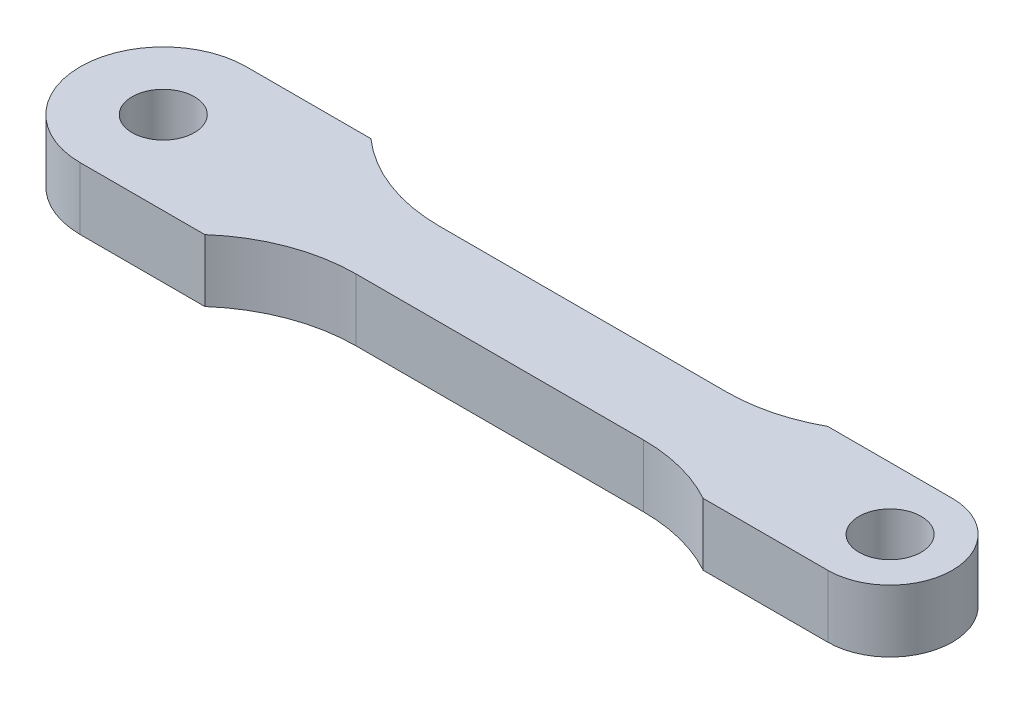
ISO-10303-21;
HEADER;
FILE_DESCRIPTION(('STEP AP214'),'2;1');
FILE_NAME('part.step','',(''),(''),'','','');
FILE_SCHEMA(('AUTOMOTIVE_DESIGN { 1 0 10303 214 1 1 1 1 }'));
ENDSEC;
DATA;
#1=APPLICATION_CONTEXT('core data for automotive mechanical design processes');
#2=APPLICATION_PROTOCOL_DEFINITION('international standard','automotive_design',2000,#1);
#3=PRODUCT_CONTEXT('',#1,'mechanical');
#4=PRODUCT('Part','Part','',(#3));
#5=PRODUCT_RELATED_PRODUCT_CATEGORY('part','',(#4));
#6=PRODUCT_DEFINITION_FORMATION('','',#4);
#7=PRODUCT_DEFINITION_CONTEXT('part definition',#1,'design');
#8=PRODUCT_DEFINITION('design','',#6,#7);
#9=PRODUCT_DEFINITION_SHAPE('','',#8);
#10=(LENGTH_UNIT() NAMED_UNIT(*) SI_UNIT(.MILLI.,.METRE.));
#11=(NAMED_UNIT(*) PLANE_ANGLE_UNIT() SI_UNIT($,.RADIAN.));
#12=(NAMED_UNIT(*) SI_UNIT($,.STERADIAN.) SOLID_ANGLE_UNIT());
#13=UNCERTAINTY_MEASURE_WITH_UNIT(LENGTH_MEASURE(1.E-05),#10,'distance_accuracy_value','');
#14=(GEOMETRIC_REPRESENTATION_CONTEXT(3) GLOBAL_UNCERTAINTY_ASSIGNED_CONTEXT((#13)) GLOBAL_UNIT_ASSIGNED_CONTEXT((#10,
#11,#12)) REPRESENTATION_CONTEXT('',''));
#15=CARTESIAN_POINT('',(0.,0.,0.));
#16=DIRECTION('',(0.,0.,1.));
#17=DIRECTION('',(1.,0.,0.));
#18=AXIS2_PLACEMENT_3D('',#15,#16,#17);
#19=CARTESIAN_POINT('',(0.,1.5,2.99999999999999));
#20=DIRECTION('',(0.,0.,1.));
#21=DIRECTION('',(1.,0.,0.));
#22=AXIS2_PLACEMENT_3D('',#19,#20,#21);
#23=PLANE('',#22);
#24=DIRECTION('',(-1.,0.,0.));
#25=VECTOR('',#24,1.);
#26=CARTESIAN_POINT('',(0.,-1.5,2.99999999999999));
#27=LINE('',#26,#25);
#28=CARTESIAN_POINT('',(17.5,-1.5,3.));
#29=VERTEX_POINT('',#28);
#30=CARTESIAN_POINT('',(11.5,-1.5,3.));
#31=VERTEX_POINT('',#30);
#32=EDGE_CURVE('E161',#29,#31,#27,.T.);
#33=ORIENTED_EDGE('',*,*,#32,.F.);
#34=DIRECTION('',(0.,-1.,0.));
#35=VECTOR('',#34,1.);
#36=CARTESIAN_POINT('',(17.5,1.5,3.));
#37=LINE('',#36,#35);
#38=CARTESIAN_POINT('',(17.5,1.5,3.));
#39=VERTEX_POINT('',#38);
#40=EDGE_CURVE('E11',#39,#29,#37,.T.);
#41=ORIENTED_EDGE('',*,*,#40,.F.);
#42=DIRECTION('',(-1.,0.,0.));
#43=VECTOR('',#42,1.);
#44=CARTESIAN_POINT('',(0.,1.5,2.99999999999999));
#45=LINE('',#44,#43);
#46=CARTESIAN_POINT('',(11.5,1.5,3.));
#47=VERTEX_POINT('',#46);
#48=EDGE_CURVE('E196',#39,#47,#45,.T.);
#49=ORIENTED_EDGE('',*,*,#48,.T.);
#50=DIRECTION('',(0.,-1.,0.));
#51=VECTOR('',#50,1.);
#52=CARTESIAN_POINT('',(11.5,1.5,3.));
#53=LINE('',#52,#51);
#54=EDGE_CURVE('E99',#47,#31,#53,.T.);
#55=ORIENTED_EDGE('',*,*,#54,.T.);
#56=EDGE_LOOP('',(#33,#41,#49,#55));
#57=FACE_BOUND('',#56,.T.);
#58=ADVANCED_FACE('F37',(#57),#23,.T.);
#59=CARTESIAN_POINT('',(17.5,1.5,0.));
#60=DIRECTION('',(0.,-1.,0.));
#61=DIRECTION('',(0.,0.,-1.));
#62=AXIS2_PLACEMENT_3D('',#59,#60,#61);
#63=CYLINDRICAL_SURFACE('',#62,3.);
#64=CARTESIAN_POINT('',(17.5,-1.5,0.));
#65=DIRECTION('',(0.,1.,0.));
#66=DIRECTION('',(0.,0.,1.));
#67=AXIS2_PLACEMENT_3D('',#64,#65,#66);
#68=CIRCLE('',#67,3.);
#69=CARTESIAN_POINT('',(17.5,-1.5,-3.));
#70=VERTEX_POINT('',#69);
#71=EDGE_CURVE('E164',#29,#70,#68,.T.);
#72=ORIENTED_EDGE('',*,*,#71,.T.);
#73=DIRECTION('',(0.,-1.,0.));
#74=VECTOR('',#73,1.);
#75=CARTESIAN_POINT('',(17.5,1.5,-3.));
#76=LINE('',#75,#74);
#77=CARTESIAN_POINT('',(17.5,1.5,-3.));
#78=VERTEX_POINT('',#77);
#79=EDGE_CURVE('E45',#78,#70,#76,.T.);
#80=ORIENTED_EDGE('',*,*,#79,.F.);
#81=CARTESIAN_POINT('',(17.5,1.5,0.));
#82=DIRECTION('',(0.,1.,0.));
#83=DIRECTION('',(0.,0.,1.));
#84=AXIS2_PLACEMENT_3D('',#81,#82,#83);
#85=CIRCLE('',#84,3.);
#86=EDGE_CURVE('E239',#39,#78,#85,.T.);
#87=ORIENTED_EDGE('',*,*,#86,.F.);
#88=ORIENTED_EDGE('',*,*,#40,.T.);
#89=EDGE_LOOP('',(#72,#80,#87,#88));
#90=FACE_BOUND('',#89,.T.);
#91=ADVANCED_FACE('F259',(#90),#63,.T.);
#92=CARTESIAN_POINT('',(0.,1.5,-2.99999999999999));
#93=DIRECTION('',(0.,0.,1.));
#94=DIRECTION('',(1.,0.,0.));
#95=AXIS2_PLACEMENT_3D('',#92,#93,#94);
#96=PLANE('',#95);
#97=DIRECTION('',(-1.,0.,0.));
#98=VECTOR('',#97,1.);
#99=CARTESIAN_POINT('',(0.,-1.5,-2.99999999999999));
#100=LINE('',#99,#98);
#101=CARTESIAN_POINT('',(11.5,-1.5,-3.));
#102=VERTEX_POINT('',#101);
#103=EDGE_CURVE('E166',#70,#102,#100,.T.);
#104=ORIENTED_EDGE('',*,*,#103,.T.);
#105=DIRECTION('',(0.,-1.,0.));
#106=VECTOR('',#105,1.);
#107=CARTESIAN_POINT('',(11.5,1.5,-3.));
#108=LINE('',#107,#106);
#109=CARTESIAN_POINT('',(11.5,1.5,-3.));
#110=VERTEX_POINT('',#109);
#111=EDGE_CURVE('E212',#110,#102,#108,.T.);
#112=ORIENTED_EDGE('',*,*,#111,.F.);
#113=DIRECTION('',(-1.,0.,0.));
#114=VECTOR('',#113,1.);
#115=CARTESIAN_POINT('',(0.,1.5,-2.99999999999999));
#116=LINE('',#115,#114);
#117=EDGE_CURVE('E220',#78,#110,#116,.T.);
#118=ORIENTED_EDGE('',*,*,#117,.F.);
#119=ORIENTED_EDGE('',*,*,#79,.T.);
#120=EDGE_LOOP('',(#104,#112,#118,#119));
#121=FACE_BOUND('',#120,.T.);
#122=ADVANCED_FACE('F218',(#121),#96,.F.);
#123=CARTESIAN_POINT('',(7.62701665379259,1.5,-10.));
#124=DIRECTION('',(0.,-1.,0.));
#125=DIRECTION('',(0.,0.,-1.));
#126=AXIS2_PLACEMENT_3D('',#123,#124,#125);
#127=CYLINDRICAL_SURFACE('',#126,8.);
#128=CARTESIAN_POINT('',(7.62701665379259,-1.5,-10.));
#129=DIRECTION('',(0.,1.,0.));
#130=DIRECTION('',(0.,0.,1.));
#131=AXIS2_PLACEMENT_3D('',#128,#129,#130);
#132=CIRCLE('',#131,8.);
#133=CARTESIAN_POINT('',(7.62701665379259,-1.5,-2.));
#134=VERTEX_POINT('',#133);
#135=EDGE_CURVE('E169',#134,#102,#132,.T.);
#136=ORIENTED_EDGE('',*,*,#135,.F.);
#137=DIRECTION('',(0.,-1.,0.));
#138=VECTOR('',#137,1.);
#139=CARTESIAN_POINT('',(7.62701665379259,1.5,-2.));
#140=LINE('',#139,#138);
#141=CARTESIAN_POINT('',(7.62701665379259,1.5,-2.));
#142=VERTEX_POINT('',#141);
#143=EDGE_CURVE('E210',#142,#134,#140,.T.);
#144=ORIENTED_EDGE('',*,*,#143,.F.);
#145=CARTESIAN_POINT('',(7.62701665379259,1.5,-10.));
#146=DIRECTION('',(0.,1.,0.));
#147=DIRECTION('',(0.,0.,1.));
#148=AXIS2_PLACEMENT_3D('',#145,#146,#147);
#149=CIRCLE('',#148,8.);
#150=EDGE_CURVE('E234',#142,#110,#149,.T.);
#151=ORIENTED_EDGE('',*,*,#150,.T.);
#152=ORIENTED_EDGE('',*,*,#111,.T.);
#153=EDGE_LOOP('',(#136,#144,#151,#152));
#154=FACE_BOUND('',#153,.T.);
#155=ADVANCED_FACE('F230',(#154),#127,.F.);
#156=CARTESIAN_POINT('',(0.,1.5,-2.));
#157=DIRECTION('',(0.,0.,1.));
#158=DIRECTION('',(1.,0.,0.));
#159=AXIS2_PLACEMENT_3D('',#156,#157,#158);
#160=PLANE('',#159);
#161=DIRECTION('',(-1.,0.,0.));
#162=VECTOR('',#161,1.);
#163=CARTESIAN_POINT('',(0.,-1.5,-2.));
#164=LINE('',#163,#162);
#165=CARTESIAN_POINT('',(-6.20849737787082,-1.5,-2.));
#166=VERTEX_POINT('',#165);
#167=EDGE_CURVE('E172',#134,#166,#164,.T.);
#168=ORIENTED_EDGE('',*,*,#167,.T.);
#169=DIRECTION('',(0.,-1.,0.));
#170=VECTOR('',#169,1.);
#171=CARTESIAN_POINT('',(-6.20849737787082,1.5,-2.));
#172=LINE('',#171,#170);
#173=CARTESIAN_POINT('',(-6.20849737787082,1.5,-2.));
#174=VERTEX_POINT('',#173);
#175=EDGE_CURVE('E207',#174,#166,#172,.T.);
#176=ORIENTED_EDGE('',*,*,#175,.F.);
#177=DIRECTION('',(-1.,0.,0.));
#178=VECTOR('',#177,1.);
#179=CARTESIAN_POINT('',(0.,1.5,-2.));
#180=LINE('',#179,#178);
#181=EDGE_CURVE('E235',#142,#174,#180,.T.);
#182=ORIENTED_EDGE('',*,*,#181,.F.);
#183=ORIENTED_EDGE('',*,*,#143,.T.);
#184=EDGE_LOOP('',(#168,#176,#182,#183));
#185=FACE_BOUND('',#184,.T.);
#186=ADVANCED_FACE('F269',(#185),#160,.F.);
#187=CARTESIAN_POINT('',(-6.20849737787082,1.5,-10.));
#188=DIRECTION('',(0.,-1.,0.));
#189=DIRECTION('',(0.,0.,-1.));
#190=AXIS2_PLACEMENT_3D('',#187,#188,#189);
#191=CYLINDRICAL_SURFACE('',#190,8.);
#192=CARTESIAN_POINT('',(-6.20849737787082,-1.5,-10.));
#193=DIRECTION('',(0.,1.,0.));
#194=DIRECTION('',(0.,0.,1.));
#195=AXIS2_PLACEMENT_3D('',#192,#193,#194);
#196=CIRCLE('',#195,8.);
#197=CARTESIAN_POINT('',(-11.5,-1.5,-4.));
#198=VERTEX_POINT('',#197);
#199=EDGE_CURVE('E174',#166,#198,#196,.F.);
#200=ORIENTED_EDGE('',*,*,#199,.T.);
#201=DIRECTION('',(0.,-1.,0.));
#202=VECTOR('',#201,1.);
#203=CARTESIAN_POINT('',(-11.5,1.5,-4.));
#204=LINE('',#203,#202);
#205=CARTESIAN_POINT('',(-11.5,1.5,-4.));
#206=VERTEX_POINT('',#205);
#207=EDGE_CURVE('E205',#206,#198,#204,.T.);
#208=ORIENTED_EDGE('',*,*,#207,.F.);
#209=CARTESIAN_POINT('',(-6.20849737787082,1.5,-10.));
#210=DIRECTION('',(0.,1.,0.));
#211=DIRECTION('',(0.,0.,1.));
#212=AXIS2_PLACEMENT_3D('',#209,#210,#211);
#213=CIRCLE('',#212,8.);
#214=EDGE_CURVE('E237',#174,#206,#213,.F.);
#215=ORIENTED_EDGE('',*,*,#214,.F.);
#216=ORIENTED_EDGE('',*,*,#175,.T.);
#217=EDGE_LOOP('',(#200,#208,#215,#216));
#218=FACE_BOUND('',#217,.T.);
#219=ADVANCED_FACE('F272',(#218),#191,.F.);
#220=CARTESIAN_POINT('',(0.,1.5,-3.99999999999999));
#221=DIRECTION('',(0.,0.,-1.));
#222=DIRECTION('',(-1.,0.,0.));
#223=AXIS2_PLACEMENT_3D('',#220,#221,#222);
#224=PLANE('',#223);
#225=DIRECTION('',(1.,0.,0.));
#226=VECTOR('',#225,1.);
#227=CARTESIAN_POINT('',(0.,-1.5,-3.99999999999999));
#228=LINE('',#227,#226);
#229=CARTESIAN_POINT('',(-17.5,-1.5,-4.00000000000001));
#230=VERTEX_POINT('',#229);
#231=EDGE_CURVE('E177',#230,#198,#228,.T.);
#232=ORIENTED_EDGE('',*,*,#231,.F.);
#233=DIRECTION('',(0.,-1.,0.));
#234=VECTOR('',#233,1.);
#235=CARTESIAN_POINT('',(-17.5,1.5,-4.00000000000001));
#236=LINE('',#235,#234);
#237=CARTESIAN_POINT('',(-17.5,1.5,-4.00000000000001));
#238=VERTEX_POINT('',#237);
#239=EDGE_CURVE('E203',#238,#230,#236,.T.);
#240=ORIENTED_EDGE('',*,*,#239,.F.);
#241=DIRECTION('',(1.,0.,0.));
#242=VECTOR('',#241,1.);
#243=CARTESIAN_POINT('',(0.,1.5,-3.99999999999999));
#244=LINE('',#243,#242);
#245=EDGE_CURVE('E244',#238,#206,#244,.T.);
#246=ORIENTED_EDGE('',*,*,#245,.T.);
#247=ORIENTED_EDGE('',*,*,#207,.T.);
#248=EDGE_LOOP('',(#232,#240,#246,#247));
#249=FACE_BOUND('',#248,.T.);
#250=ADVANCED_FACE('F276',(#249),#224,.T.);
#251=CARTESIAN_POINT('',(-17.5,1.5,0.));
#252=DIRECTION('',(0.,-1.,0.));
#253=DIRECTION('',(0.,0.,-1.));
#254=AXIS2_PLACEMENT_3D('',#251,#252,#253);
#255=CYLINDRICAL_SURFACE('',#254,4.00000000000001);
#256=CARTESIAN_POINT('',(-17.5,-1.5,0.));
#257=DIRECTION('',(0.,1.,0.));
#258=DIRECTION('',(0.,0.,1.));
#259=AXIS2_PLACEMENT_3D('',#256,#257,#258);
#260=CIRCLE('',#259,4.00000000000001);
#261=CARTESIAN_POINT('',(-17.5,-1.5,4.00000000000001));
#262=VERTEX_POINT('',#261);
#263=EDGE_CURVE('E180',#230,#262,#260,.T.);
#264=ORIENTED_EDGE('',*,*,#263,.T.);
#265=DIRECTION('',(0.,-1.,0.));
#266=VECTOR('',#265,1.);
#267=CARTESIAN_POINT('',(-17.5,1.5,4.00000000000001));
#268=LINE('',#267,#266);
#269=CARTESIAN_POINT('',(-17.5,1.5,4.00000000000001));
#270=VERTEX_POINT('',#269);
#271=EDGE_CURVE('E200',#270,#262,#268,.T.);
#272=ORIENTED_EDGE('',*,*,#271,.F.);
#273=CARTESIAN_POINT('',(-17.5,1.5,0.));
#274=DIRECTION('',(0.,1.,0.));
#275=DIRECTION('',(0.,0.,1.));
#276=AXIS2_PLACEMENT_3D('',#273,#274,#275);
#277=CIRCLE('',#276,4.00000000000001);
#278=EDGE_CURVE('E247',#238,#270,#277,.T.);
#279=ORIENTED_EDGE('',*,*,#278,.F.);
#280=ORIENTED_EDGE('',*,*,#239,.T.);
#281=EDGE_LOOP('',(#264,#272,#279,#280));
#282=FACE_BOUND('',#281,.T.);
#283=ADVANCED_FACE('F252',(#282),#255,.T.);
#284=CARTESIAN_POINT('',(0.,1.5,3.99999999999999));
#285=DIRECTION('',(0.,0.,-1.));
#286=DIRECTION('',(-1.,0.,0.));
#287=AXIS2_PLACEMENT_3D('',#284,#285,#286);
#288=PLANE('',#287);
#289=DIRECTION('',(1.,0.,0.));
#290=VECTOR('',#289,1.);
#291=CARTESIAN_POINT('',(0.,-1.5,3.99999999999999));
#292=LINE('',#291,#290);
#293=CARTESIAN_POINT('',(-11.5,-1.5,4.));
#294=VERTEX_POINT('',#293);
#295=EDGE_CURVE('E182',#262,#294,#292,.T.);
#296=ORIENTED_EDGE('',*,*,#295,.T.);
#297=DIRECTION('',(0.,-1.,0.));
#298=VECTOR('',#297,1.);
#299=CARTESIAN_POINT('',(-11.5,1.5,4.));
#300=LINE('',#299,#298);
#301=CARTESIAN_POINT('',(-11.5,1.5,4.));
#302=VERTEX_POINT('',#301);
#303=EDGE_CURVE('E141',#302,#294,#300,.T.);
#304=ORIENTED_EDGE('',*,*,#303,.F.);
#305=DIRECTION('',(1.,0.,0.));
#306=VECTOR('',#305,1.);
#307=CARTESIAN_POINT('',(0.,1.5,3.99999999999999));
#308=LINE('',#307,#306);
#309=EDGE_CURVE('E147',#270,#302,#308,.T.);
#310=ORIENTED_EDGE('',*,*,#309,.F.);
#311=ORIENTED_EDGE('',*,*,#271,.T.);
#312=EDGE_LOOP('',(#296,#304,#310,#311));
#313=FACE_BOUND('',#312,.T.);
#314=ADVANCED_FACE('F256',(#313),#288,.F.);
#315=CARTESIAN_POINT('',(-6.20849737787082,1.5,10.));
#316=DIRECTION('',(0.,-1.,0.));
#317=DIRECTION('',(0.,0.,-1.));
#318=AXIS2_PLACEMENT_3D('',#315,#316,#317);
#319=CYLINDRICAL_SURFACE('',#318,8.);
#320=CARTESIAN_POINT('',(-6.20849737787082,-1.5,10.));
#321=DIRECTION('',(0.,1.,0.));
#322=DIRECTION('',(0.,0.,1.));
#323=AXIS2_PLACEMENT_3D('',#320,#321,#322);
#324=CIRCLE('',#323,8.);
#325=CARTESIAN_POINT('',(-6.20849737787082,-1.5,2.));
#326=VERTEX_POINT('',#325);
#327=EDGE_CURVE('E136',#326,#294,#324,.T.);
#328=ORIENTED_EDGE('',*,*,#327,.F.);
#329=DIRECTION('',(0.,-1.,0.));
#330=VECTOR('',#329,1.);
#331=CARTESIAN_POINT('',(-6.20849737787082,1.5,2.));
#332=LINE('',#331,#330);
#333=CARTESIAN_POINT('',(-6.20849737787082,1.5,2.));
#334=VERTEX_POINT('',#333);
#335=EDGE_CURVE('E131',#334,#326,#332,.T.);
#336=ORIENTED_EDGE('',*,*,#335,.F.);
#337=CARTESIAN_POINT('',(-6.20849737787082,1.5,10.));
#338=DIRECTION('',(0.,1.,0.));
#339=DIRECTION('',(0.,0.,1.));
#340=AXIS2_PLACEMENT_3D('',#337,#338,#339);
#341=CIRCLE('',#340,8.);
#342=EDGE_CURVE('E134',#334,#302,#341,.T.);
#343=ORIENTED_EDGE('',*,*,#342,.T.);
#344=ORIENTED_EDGE('',*,*,#303,.T.);
#345=EDGE_LOOP('',(#328,#336,#343,#344));
#346=FACE_BOUND('',#345,.T.);
#347=ADVANCED_FACE('F133',(#346),#319,.F.);
#348=CARTESIAN_POINT('',(0.,1.5,2.));
#349=DIRECTION('',(0.,0.,1.));
#350=DIRECTION('',(1.,0.,0.));
#351=AXIS2_PLACEMENT_3D('',#348,#349,#350);
#352=PLANE('',#351);
#353=DIRECTION('',(-1.,0.,0.));
#354=VECTOR('',#353,1.);
#355=CARTESIAN_POINT('',(0.,-1.5,2.));
#356=LINE('',#355,#354);
#357=CARTESIAN_POINT('',(7.62701665379259,-1.5,2.));
#358=VERTEX_POINT('',#357);
#359=EDGE_CURVE('E186',#358,#326,#356,.T.);
#360=ORIENTED_EDGE('',*,*,#359,.F.);
#361=DIRECTION('',(0.,-1.,0.));
#362=VECTOR('',#361,1.);
#363=CARTESIAN_POINT('',(7.62701665379259,1.5,2.));
#364=LINE('',#363,#362);
#365=CARTESIAN_POINT('',(7.62701665379259,1.5,2.));
#366=VERTEX_POINT('',#365);
#367=EDGE_CURVE('E92',#366,#358,#364,.T.);
#368=ORIENTED_EDGE('',*,*,#367,.F.);
#369=DIRECTION('',(-1.,0.,0.));
#370=VECTOR('',#369,1.);
#371=CARTESIAN_POINT('',(0.,1.5,2.));
#372=LINE('',#371,#370);
#373=EDGE_CURVE('E145',#366,#334,#372,.T.);
#374=ORIENTED_EDGE('',*,*,#373,.T.);
#375=ORIENTED_EDGE('',*,*,#335,.T.);
#376=EDGE_LOOP('',(#360,#368,#374,#375));
#377=FACE_BOUND('',#376,.T.);
#378=ADVANCED_FACE('F150',(#377),#352,.T.);
#379=CARTESIAN_POINT('',(17.5,1.5,0.));
#380=DIRECTION('',(0.,-1.,0.));
#381=DIRECTION('',(0.,0.,-1.));
#382=AXIS2_PLACEMENT_3D('',#379,#380,#381);
#383=CYLINDRICAL_SURFACE('',#382,1.5);
#384=CARTESIAN_POINT('',(17.5,1.5,0.));
#385=DIRECTION('',(0.,1.,0.));
#386=DIRECTION('',(0.,0.,1.));
#387=AXIS2_PLACEMENT_3D('',#384,#385,#386);
#388=CIRCLE('',#387,1.5);
#389=CARTESIAN_POINT('',(17.5,1.5,1.5));
#390=VERTEX_POINT('',#389);
#391=EDGE_CURVE('E152',#390,#390,#388,.T.);
#392=ORIENTED_EDGE('',*,*,#391,.T.);
#393=EDGE_LOOP('',(#392));
#394=FACE_BOUND('',#393,.T.);
#395=CARTESIAN_POINT('',(17.5,-1.5,0.));
#396=DIRECTION('',(0.,1.,0.));
#397=DIRECTION('',(0.,0.,1.));
#398=AXIS2_PLACEMENT_3D('',#395,#396,#397);
#399=CIRCLE('',#398,1.5);
#400=CARTESIAN_POINT('',(17.5,-1.5,1.5));
#401=VERTEX_POINT('',#400);
#402=EDGE_CURVE('E190',#401,#401,#399,.T.);
#403=ORIENTED_EDGE('',*,*,#402,.F.);
#404=EDGE_LOOP('',(#403));
#405=FACE_BOUND('',#404,.T.);
#406=ADVANCED_FACE('F289',(#394,#405),#383,.F.);
#407=CARTESIAN_POINT('',(7.62701665379259,1.5,10.));
#408=DIRECTION('',(0.,-1.,0.));
#409=DIRECTION('',(0.,0.,-1.));
#410=AXIS2_PLACEMENT_3D('',#407,#408,#409);
#411=CYLINDRICAL_SURFACE('',#410,8.);
#412=CARTESIAN_POINT('',(7.62701665379259,-1.5,10.));
#413=DIRECTION('',(0.,1.,0.));
#414=DIRECTION('',(0.,0.,1.));
#415=AXIS2_PLACEMENT_3D('',#412,#413,#414);
#416=CIRCLE('',#415,8.);
#417=EDGE_CURVE('E188',#358,#31,#416,.F.);
#418=ORIENTED_EDGE('',*,*,#417,.T.);
#419=ORIENTED_EDGE('',*,*,#54,.F.);
#420=CARTESIAN_POINT('',(7.62701665379259,1.5,10.));
#421=DIRECTION('',(0.,1.,0.));
#422=DIRECTION('',(0.,0.,1.));
#423=AXIS2_PLACEMENT_3D('',#420,#421,#422);
#424=CIRCLE('',#423,8.);
#425=EDGE_CURVE('E53',#366,#47,#424,.F.);
#426=ORIENTED_EDGE('',*,*,#425,.F.);
#427=ORIENTED_EDGE('',*,*,#367,.T.);
#428=EDGE_LOOP('',(#418,#419,#426,#427));
#429=FACE_BOUND('',#428,.T.);
#430=ADVANCED_FACE('F257',(#429),#411,.F.);
#431=CARTESIAN_POINT('',(-17.5,1.5,0.));
#432=DIRECTION('',(0.,-1.,0.));
#433=DIRECTION('',(0.,0.,-1.));
#434=AXIS2_PLACEMENT_3D('',#431,#432,#433);
#435=CYLINDRICAL_SURFACE('',#434,1.5);
#436=CARTESIAN_POINT('',(-17.5,1.5,0.));
#437=DIRECTION('',(0.,1.,0.));
#438=DIRECTION('',(0.,0.,1.));
#439=AXIS2_PLACEMENT_3D('',#436,#437,#438);
#440=CIRCLE('',#439,1.5);
#441=CARTESIAN_POINT('',(-17.5,1.5,1.5));
#442=VERTEX_POINT('',#441);
#443=EDGE_CURVE('E158',#442,#442,#440,.T.);
#444=ORIENTED_EDGE('',*,*,#443,.T.);
#445=EDGE_LOOP('',(#444));
#446=FACE_BOUND('',#445,.T.);
#447=CARTESIAN_POINT('',(-17.5,-1.5,0.));
#448=DIRECTION('',(0.,1.,0.));
#449=DIRECTION('',(0.,0.,1.));
#450=AXIS2_PLACEMENT_3D('',#447,#448,#449);
#451=CIRCLE('',#450,1.5);
#452=CARTESIAN_POINT('',(-17.5,-1.5,1.5));
#453=VERTEX_POINT('',#452);
#454=EDGE_CURVE('E193',#453,#453,#451,.T.);
#455=ORIENTED_EDGE('',*,*,#454,.F.);
#456=EDGE_LOOP('',(#455));
#457=FACE_BOUND('',#456,.T.);
#458=ADVANCED_FACE('F292',(#446,#457),#435,.F.);
#459=CARTESIAN_POINT('',(0.,1.5,0.));
#460=DIRECTION('',(0.,1.,0.));
#461=DIRECTION('',(0.,0.,1.));
#462=AXIS2_PLACEMENT_3D('',#459,#460,#461);
#463=PLANE('',#462);
#464=ORIENTED_EDGE('',*,*,#48,.F.);
#465=ORIENTED_EDGE('',*,*,#86,.T.);
#466=ORIENTED_EDGE('',*,*,#117,.T.);
#467=ORIENTED_EDGE('',*,*,#150,.F.);
#468=ORIENTED_EDGE('',*,*,#181,.T.);
#469=ORIENTED_EDGE('',*,*,#214,.T.);
#470=ORIENTED_EDGE('',*,*,#245,.F.);
#471=ORIENTED_EDGE('',*,*,#278,.T.);
#472=ORIENTED_EDGE('',*,*,#309,.T.);
#473=ORIENTED_EDGE('',*,*,#342,.F.);
#474=ORIENTED_EDGE('',*,*,#373,.F.);
#475=ORIENTED_EDGE('',*,*,#425,.T.);
#476=EDGE_LOOP('',(#464,#465,#466,#467,#468,#469,#470,#471,#472,#473,#474,#475));
#477=FACE_BOUND('',#476,.T.);
#478=ORIENTED_EDGE('',*,*,#391,.F.);
#479=EDGE_LOOP('',(#478));
#480=FACE_BOUND('',#479,.T.);
#481=ORIENTED_EDGE('',*,*,#443,.F.);
#482=EDGE_LOOP('',(#481));
#483=FACE_BOUND('',#482,.T.);
#484=ADVANCED_FACE('F143',(#477,#480,#483),#463,.T.);
#485=CARTESIAN_POINT('',(0.,-1.5,0.));
#486=DIRECTION('',(0.,1.,0.));
#487=DIRECTION('',(0.,0.,1.));
#488=AXIS2_PLACEMENT_3D('',#485,#486,#487);
#489=PLANE('',#488);
#490=ORIENTED_EDGE('',*,*,#32,.T.);
#491=ORIENTED_EDGE('',*,*,#417,.F.);
#492=ORIENTED_EDGE('',*,*,#359,.T.);
#493=ORIENTED_EDGE('',*,*,#327,.T.);
#494=ORIENTED_EDGE('',*,*,#295,.F.);
#495=ORIENTED_EDGE('',*,*,#263,.F.);
#496=ORIENTED_EDGE('',*,*,#231,.T.);
#497=ORIENTED_EDGE('',*,*,#199,.F.);
#498=ORIENTED_EDGE('',*,*,#167,.F.);
#499=ORIENTED_EDGE('',*,*,#135,.T.);
#500=ORIENTED_EDGE('',*,*,#103,.F.);
#501=ORIENTED_EDGE('',*,*,#71,.F.);
#502=EDGE_LOOP('',(#490,#491,#492,#493,#494,#495,#496,#497,#498,#499,#500,#501));
#503=FACE_BOUND('',#502,.T.);
#504=ORIENTED_EDGE('',*,*,#402,.T.);
#505=EDGE_LOOP('',(#504));
#506=FACE_BOUND('',#505,.T.);
#507=ORIENTED_EDGE('',*,*,#454,.T.);
#508=EDGE_LOOP('',(#507));
#509=FACE_BOUND('',#508,.T.);
#510=ADVANCED_FACE('F224',(#503,#506,#509),#489,.F.);
#511=CLOSED_SHELL('',(#58,#91,#122,#155,#186,#219,#250,#283,#314,#347,#378,#406,#430,#458,#484,#510));
#512=MANIFOLD_SOLID_BREP('B2',#511);
#513=ADVANCED_BREP_SHAPE_REPRESENTATION('',(#18,#512),#14);
#514=SHAPE_DEFINITION_REPRESENTATION(#9,#513);
ENDSEC;
END-ISO-10303-21;
